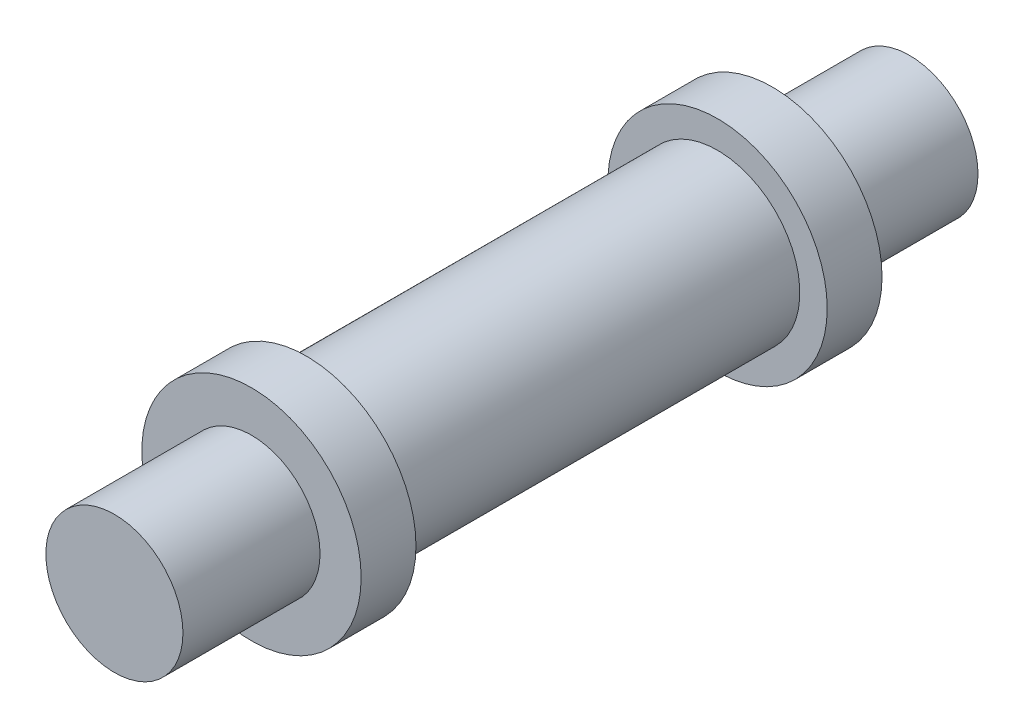
ISO-10303-21;
HEADER;
FILE_DESCRIPTION(('STEP AP214'),'2;1');
FILE_NAME('part.step','',(''),(''),'','','');
FILE_SCHEMA(('AUTOMOTIVE_DESIGN { 1 0 10303 214 1 1 1 1 }'));
ENDSEC;
DATA;
#1=APPLICATION_CONTEXT('core data for automotive mechanical design processes');
#2=APPLICATION_PROTOCOL_DEFINITION('international standard','automotive_design',2000,#1);
#3=PRODUCT_CONTEXT('',#1,'mechanical');
#4=PRODUCT('Part','Part','',(#3));
#5=PRODUCT_RELATED_PRODUCT_CATEGORY('part','',(#4));
#6=PRODUCT_DEFINITION_FORMATION('','',#4);
#7=PRODUCT_DEFINITION_CONTEXT('part definition',#1,'design');
#8=PRODUCT_DEFINITION('design','',#6,#7);
#9=PRODUCT_DEFINITION_SHAPE('','',#8);
#10=(LENGTH_UNIT() NAMED_UNIT(*) SI_UNIT(.MILLI.,.METRE.));
#11=(NAMED_UNIT(*) PLANE_ANGLE_UNIT() SI_UNIT($,.RADIAN.));
#12=(NAMED_UNIT(*) SI_UNIT($,.STERADIAN.) SOLID_ANGLE_UNIT());
#13=UNCERTAINTY_MEASURE_WITH_UNIT(LENGTH_MEASURE(1.E-05),#10,'distance_accuracy_value','');
#14=(GEOMETRIC_REPRESENTATION_CONTEXT(3) GLOBAL_UNCERTAINTY_ASSIGNED_CONTEXT((#13)) GLOBAL_UNIT_ASSIGNED_CONTEXT((#10,
#11,#12)) REPRESENTATION_CONTEXT('',''));
#15=CARTESIAN_POINT('',(0.,0.,0.));
#16=DIRECTION('',(0.,0.,1.));
#17=DIRECTION('',(1.,0.,0.));
#18=AXIS2_PLACEMENT_3D('',#15,#16,#17);
#19=CARTESIAN_POINT('',(0.,0.,6.35));
#20=DIRECTION('',(0.,0.,-1.));
#21=DIRECTION('',(-1.,0.,0.));
#22=AXIS2_PLACEMENT_3D('',#19,#20,#21);
#23=CYLINDRICAL_SURFACE('',#22,3.175);
#24=CARTESIAN_POINT('',(0.,0.,6.35));
#25=DIRECTION('',(0.,0.,1.));
#26=DIRECTION('',(1.,0.,0.));
#27=AXIS2_PLACEMENT_3D('',#24,#25,#26);
#28=CIRCLE('',#27,3.175);
#29=CARTESIAN_POINT('',(3.175,0.,6.35));
#30=VERTEX_POINT('',#29);
#31=EDGE_CURVE('E57',#30,#30,#28,.T.);
#32=ORIENTED_EDGE('',*,*,#31,.F.);
#33=EDGE_LOOP('',(#32));
#34=FACE_BOUND('',#33,.T.);
#35=CARTESIAN_POINT('',(0.,0.,0.));
#36=DIRECTION('',(0.,0.,1.));
#37=DIRECTION('',(1.,0.,0.));
#38=AXIS2_PLACEMENT_3D('',#35,#36,#37);
#39=CIRCLE('',#38,3.175);
#40=CARTESIAN_POINT('',(3.175,0.,0.));
#41=VERTEX_POINT('',#40);
#42=EDGE_CURVE('E46',#41,#41,#39,.T.);
#43=ORIENTED_EDGE('',*,*,#42,.T.);
#44=EDGE_LOOP('',(#43));
#45=FACE_BOUND('',#44,.T.);
#46=ADVANCED_FACE('F43',(#34,#45),#23,.T.);
#47=CARTESIAN_POINT('',(0.,0.,0.));
#48=DIRECTION('',(0.,0.,1.));
#49=DIRECTION('',(1.,0.,0.));
#50=AXIS2_PLACEMENT_3D('',#47,#48,#49);
#51=PLANE('',#50);
#52=ORIENTED_EDGE('',*,*,#42,.F.);
#53=EDGE_LOOP('',(#52));
#54=FACE_BOUND('',#53,.T.);
#55=ADVANCED_FACE('F90',(#54),#51,.F.);
#56=CARTESIAN_POINT('',(0.,0.,8.89));
#57=DIRECTION('',(0.,0.,-1.));
#58=DIRECTION('',(-1.,0.,0.));
#59=AXIS2_PLACEMENT_3D('',#56,#57,#58);
#60=CYLINDRICAL_SURFACE('',#59,5.08);
#61=CARTESIAN_POINT('',(0.,0.,8.89));
#62=DIRECTION('',(0.,0.,1.));
#63=DIRECTION('',(1.,0.,0.));
#64=AXIS2_PLACEMENT_3D('',#61,#62,#63);
#65=CIRCLE('',#64,5.08);
#66=CARTESIAN_POINT('',(5.08,0.,8.89));
#67=VERTEX_POINT('',#66);
#68=EDGE_CURVE('E75',#67,#67,#65,.T.);
#69=ORIENTED_EDGE('',*,*,#68,.F.);
#70=EDGE_LOOP('',(#69));
#71=FACE_BOUND('',#70,.T.);
#72=CARTESIAN_POINT('',(0.,0.,6.35));
#73=DIRECTION('',(0.,0.,1.));
#74=DIRECTION('',(1.,0.,0.));
#75=AXIS2_PLACEMENT_3D('',#72,#73,#74);
#76=CIRCLE('',#75,5.08);
#77=CARTESIAN_POINT('',(5.08,0.,6.35));
#78=VERTEX_POINT('',#77);
#79=EDGE_CURVE('E73',#78,#78,#76,.T.);
#80=ORIENTED_EDGE('',*,*,#79,.T.);
#81=EDGE_LOOP('',(#80));
#82=FACE_BOUND('',#81,.T.);
#83=ADVANCED_FACE('F92',(#71,#82),#60,.T.);
#84=CARTESIAN_POINT('',(0.,0.,8.89));
#85=DIRECTION('',(0.,0.,1.));
#86=DIRECTION('',(1.,0.,0.));
#87=AXIS2_PLACEMENT_3D('',#84,#85,#86);
#88=PLANE('',#87);
#89=CARTESIAN_POINT('',(0.,0.,8.89));
#90=DIRECTION('',(0.,0.,1.));
#91=DIRECTION('',(1.,0.,0.));
#92=AXIS2_PLACEMENT_3D('',#89,#90,#91);
#93=CIRCLE('',#92,3.81);
#94=CARTESIAN_POINT('',(-3.81,0.,8.89));
#95=VERTEX_POINT('',#94);
#96=EDGE_CURVE('E51',#95,#95,#93,.T.);
#97=ORIENTED_EDGE('',*,*,#96,.F.);
#98=EDGE_LOOP('',(#97));
#99=FACE_BOUND('',#98,.T.);
#100=ORIENTED_EDGE('',*,*,#68,.T.);
#101=EDGE_LOOP('',(#100));
#102=FACE_BOUND('',#101,.T.);
#103=ADVANCED_FACE('F97',(#99,#102),#88,.T.);
#104=CARTESIAN_POINT('',(0.,0.,6.35));
#105=DIRECTION('',(0.,0.,1.));
#106=DIRECTION('',(1.,0.,0.));
#107=AXIS2_PLACEMENT_3D('',#104,#105,#106);
#108=PLANE('',#107);
#109=ORIENTED_EDGE('',*,*,#31,.T.);
#110=EDGE_LOOP('',(#109));
#111=FACE_BOUND('',#110,.T.);
#112=ORIENTED_EDGE('',*,*,#79,.F.);
#113=EDGE_LOOP('',(#112));
#114=FACE_BOUND('',#113,.T.);
#115=ADVANCED_FACE('F102',(#111,#114),#108,.F.);
#116=CARTESIAN_POINT('',(0.,0.,27.94));
#117=DIRECTION('',(0.,0.,-1.));
#118=DIRECTION('',(-1.,0.,0.));
#119=AXIS2_PLACEMENT_3D('',#116,#117,#118);
#120=CYLINDRICAL_SURFACE('',#119,3.81);
#121=CARTESIAN_POINT('',(0.,0.,27.94));
#122=DIRECTION('',(0.,0.,1.));
#123=DIRECTION('',(1.,0.,0.));
#124=AXIS2_PLACEMENT_3D('',#121,#122,#123);
#125=CIRCLE('',#124,3.81);
#126=CARTESIAN_POINT('',(-3.81,0.,27.94));
#127=VERTEX_POINT('',#126);
#128=EDGE_CURVE('E66',#127,#127,#125,.T.);
#129=CARTESIAN_POINT('',(-3.81,0.,27.94));
#130=CARTESIAN_POINT('',(-3.81,0.,27.7415625));
#131=CARTESIAN_POINT('',(-3.81,0.,27.543125));
#132=CARTESIAN_POINT('',(-3.81,0.,27.14625));
#133=CARTESIAN_POINT('',(-3.81,0.,26.9478125));
#134=CARTESIAN_POINT('',(-3.81,0.,26.5509375));
#135=CARTESIAN_POINT('',(-3.81,0.,26.3525));
#136=CARTESIAN_POINT('',(-3.81,0.,25.955625));
#137=CARTESIAN_POINT('',(-3.81,0.,25.7571875));
#138=CARTESIAN_POINT('',(-3.81,0.,25.3603125));
#139=CARTESIAN_POINT('',(-3.81,0.,25.161875));
#140=CARTESIAN_POINT('',(-3.81,0.,24.765));
#141=CARTESIAN_POINT('',(-3.81,0.,24.5665625));
#142=CARTESIAN_POINT('',(-3.81,0.,24.1696875));
#143=CARTESIAN_POINT('',(-3.81,0.,23.97125));
#144=CARTESIAN_POINT('',(-3.81,0.,23.574375));
#145=CARTESIAN_POINT('',(-3.81,0.,23.3759375));
#146=CARTESIAN_POINT('',(-3.81,0.,22.9790625));
#147=CARTESIAN_POINT('',(-3.81,0.,22.780625));
#148=CARTESIAN_POINT('',(-3.81,0.,22.38375));
#149=CARTESIAN_POINT('',(-3.81,0.,22.1853125));
#150=CARTESIAN_POINT('',(-3.81,0.,21.7884375));
#151=CARTESIAN_POINT('',(-3.81,0.,21.59));
#152=CARTESIAN_POINT('',(-3.81,0.,21.193125));
#153=CARTESIAN_POINT('',(-3.81,0.,20.9946875));
#154=CARTESIAN_POINT('',(-3.81,0.,20.5978125));
#155=CARTESIAN_POINT('',(-3.81,0.,20.399375));
#156=CARTESIAN_POINT('',(-3.81,0.,20.0025));
#157=CARTESIAN_POINT('',(-3.81,0.,19.8040625));
#158=CARTESIAN_POINT('',(-3.81,0.,19.4071875));
#159=CARTESIAN_POINT('',(-3.81,0.,19.20875));
#160=CARTESIAN_POINT('',(-3.81,0.,18.811875));
#161=CARTESIAN_POINT('',(-3.81,0.,18.6134375));
#162=CARTESIAN_POINT('',(-3.81,0.,18.2165625));
#163=CARTESIAN_POINT('',(-3.81,0.,18.018125));
#164=CARTESIAN_POINT('',(-3.81,0.,17.62125));
#165=CARTESIAN_POINT('',(-3.81,0.,17.4228125));
#166=CARTESIAN_POINT('',(-3.81,0.,17.0259375));
#167=CARTESIAN_POINT('',(-3.81,0.,16.8275));
#168=CARTESIAN_POINT('',(-3.81,0.,16.430625));
#169=CARTESIAN_POINT('',(-3.81,0.,16.2321875));
#170=CARTESIAN_POINT('',(-3.81,0.,15.8353125));
#171=CARTESIAN_POINT('',(-3.81,0.,15.636875));
#172=CARTESIAN_POINT('',(-3.81,0.,15.24));
#173=CARTESIAN_POINT('',(-3.81,0.,15.0415625));
#174=CARTESIAN_POINT('',(-3.81,0.,14.6446875));
#175=CARTESIAN_POINT('',(-3.81,0.,14.44625));
#176=CARTESIAN_POINT('',(-3.81,0.,14.049375));
#177=CARTESIAN_POINT('',(-3.81,0.,13.8509375));
#178=CARTESIAN_POINT('',(-3.81,0.,13.4540625));
#179=CARTESIAN_POINT('',(-3.81,0.,13.255625));
#180=CARTESIAN_POINT('',(-3.81,0.,12.85875));
#181=CARTESIAN_POINT('',(-3.81,0.,12.6603125));
#182=CARTESIAN_POINT('',(-3.81,0.,12.2634375));
#183=CARTESIAN_POINT('',(-3.81,0.,12.065));
#184=CARTESIAN_POINT('',(-3.81,0.,11.668125));
#185=CARTESIAN_POINT('',(-3.81,0.,11.4696875));
#186=CARTESIAN_POINT('',(-3.81,0.,11.0728125));
#187=CARTESIAN_POINT('',(-3.81,0.,10.874375));
#188=CARTESIAN_POINT('',(-3.81,0.,10.4775));
#189=CARTESIAN_POINT('',(-3.81,0.,10.2790625));
#190=CARTESIAN_POINT('',(-3.81,0.,9.8821875));
#191=CARTESIAN_POINT('',(-3.81,0.,9.68375));
#192=CARTESIAN_POINT('',(-3.81,0.,9.286875));
#193=CARTESIAN_POINT('',(-3.81,0.,9.0884375));
#194=CARTESIAN_POINT('',(-3.81,0.,8.89));
#195=B_SPLINE_CURVE_WITH_KNOTS('',3,(#129,#130,#131,#132,#133,#134,#135,#136,#137,#138,#139,
#140,#141,#142,#143,#144,#145,#146,#147,#148,#149,#150,#151,#152,#153,#154,#155,#156,#157,#158,
#159,#160,#161,#162,#163,#164,#165,#166,#167,#168,#169,#170,#171,#172,#173,#174,#175,#176,#177,
#178,#179,#180,#181,#182,#183,#184,#185,#186,#187,#188,#189,#190,#191,#192,#193,#194),
.UNSPECIFIED.,.F.,.F.,(4,2,2,2,2,2,2,2,2,2,2,2,2,2,2,2,2,2,2,2,2,2,2,2,2,2,2,2,2,2,2,2,4),(0.,
0.5953125,1.190625,1.7859375,2.38125,2.9765625,3.571875,4.1671875,4.7625,5.3578125,5.953125,
6.5484375,7.14375,7.7390625,8.334375,8.9296875,9.525,10.1203125,10.715625,11.3109375,11.90625,
12.5015625,13.096875,13.6921875,14.2875,14.8828125,15.478125,16.0734375,16.66875,17.2640625,
17.859375,18.4546875,19.05),.UNSPECIFIED.);
#196=EDGE_CURVE('BSEAM105',#127,#95,#195,.T.);
#197=ORIENTED_EDGE('',*,*,#128,.F.);
#198=ORIENTED_EDGE('',*,*,#96,.T.);
#199=ORIENTED_EDGE('',*,*,#196,.T.);
#200=ORIENTED_EDGE('',*,*,#196,.F.);
#201=EDGE_LOOP('',(#197,#199,#198,#200));
#202=FACE_BOUND('',#201,.T.);
#203=ADVANCED_FACE('F105',(#202),#120,.T.);
#204=CARTESIAN_POINT('',(0.,0.,30.48));
#205=DIRECTION('',(0.,0.,-1.));
#206=DIRECTION('',(-1.,0.,0.));
#207=AXIS2_PLACEMENT_3D('',#204,#205,#206);
#208=CYLINDRICAL_SURFACE('',#207,5.08);
#209=CARTESIAN_POINT('',(0.,0.,30.48));
#210=DIRECTION('',(0.,0.,1.));
#211=DIRECTION('',(1.,0.,0.));
#212=AXIS2_PLACEMENT_3D('',#209,#210,#211);
#213=CIRCLE('',#212,5.08);
#214=CARTESIAN_POINT('',(5.08,0.,30.48));
#215=VERTEX_POINT('',#214);
#216=EDGE_CURVE('E62',#215,#215,#213,.T.);
#217=ORIENTED_EDGE('',*,*,#216,.F.);
#218=EDGE_LOOP('',(#217));
#219=FACE_BOUND('',#218,.T.);
#220=CARTESIAN_POINT('',(0.,0.,27.94));
#221=DIRECTION('',(0.,0.,1.));
#222=DIRECTION('',(1.,0.,0.));
#223=AXIS2_PLACEMENT_3D('',#220,#221,#222);
#224=CIRCLE('',#223,5.08);
#225=CARTESIAN_POINT('',(5.08,0.,27.94));
#226=VERTEX_POINT('',#225);
#227=EDGE_CURVE('E67',#226,#226,#224,.T.);
#228=ORIENTED_EDGE('',*,*,#227,.T.);
#229=EDGE_LOOP('',(#228));
#230=FACE_BOUND('',#229,.T.);
#231=ADVANCED_FACE('F111',(#219,#230),#208,.T.);
#232=CARTESIAN_POINT('',(0.,0.,30.48));
#233=DIRECTION('',(0.,0.,1.));
#234=DIRECTION('',(1.,0.,0.));
#235=AXIS2_PLACEMENT_3D('',#232,#233,#234);
#236=PLANE('',#235);
#237=CARTESIAN_POINT('',(0.,0.,30.48));
#238=DIRECTION('',(0.,0.,1.));
#239=DIRECTION('',(1.,0.,0.));
#240=AXIS2_PLACEMENT_3D('',#237,#238,#239);
#241=CIRCLE('',#240,3.175);
#242=CARTESIAN_POINT('',(3.175,0.,30.48));
#243=VERTEX_POINT('',#242);
#244=EDGE_CURVE('E10',#243,#243,#241,.T.);
#245=ORIENTED_EDGE('',*,*,#244,.F.);
#246=EDGE_LOOP('',(#245));
#247=FACE_BOUND('',#246,.T.);
#248=ORIENTED_EDGE('',*,*,#216,.T.);
#249=EDGE_LOOP('',(#248));
#250=FACE_BOUND('',#249,.T.);
#251=ADVANCED_FACE('F115',(#247,#250),#236,.T.);
#252=CARTESIAN_POINT('',(0.,0.,27.94));
#253=DIRECTION('',(0.,0.,1.));
#254=DIRECTION('',(1.,0.,0.));
#255=AXIS2_PLACEMENT_3D('',#252,#253,#254);
#256=PLANE('',#255);
#257=ORIENTED_EDGE('',*,*,#128,.T.);
#258=EDGE_LOOP('',(#257));
#259=FACE_BOUND('',#258,.T.);
#260=ORIENTED_EDGE('',*,*,#227,.F.);
#261=EDGE_LOOP('',(#260));
#262=FACE_BOUND('',#261,.T.);
#263=ADVANCED_FACE('F117',(#259,#262),#256,.F.);
#264=CARTESIAN_POINT('',(0.,0.,36.83));
#265=DIRECTION('',(0.,0.,-1.));
#266=DIRECTION('',(-1.,0.,0.));
#267=AXIS2_PLACEMENT_3D('',#264,#265,#266);
#268=CYLINDRICAL_SURFACE('',#267,3.175);
#269=CARTESIAN_POINT('',(0.,0.,36.83));
#270=DIRECTION('',(0.,0.,1.));
#271=DIRECTION('',(1.,0.,0.));
#272=AXIS2_PLACEMENT_3D('',#269,#270,#271);
#273=CIRCLE('',#272,3.175);
#274=CARTESIAN_POINT('',(3.175,0.,36.83));
#275=VERTEX_POINT('',#274);
#276=EDGE_CURVE('E61',#275,#275,#273,.T.);
#277=ORIENTED_EDGE('',*,*,#276,.F.);
#278=EDGE_LOOP('',(#277));
#279=FACE_BOUND('',#278,.T.);
#280=ORIENTED_EDGE('',*,*,#244,.T.);
#281=EDGE_LOOP('',(#280));
#282=FACE_BOUND('',#281,.T.);
#283=ADVANCED_FACE('F120',(#279,#282),#268,.T.);
#284=CARTESIAN_POINT('',(0.,0.,36.83));
#285=DIRECTION('',(0.,0.,1.));
#286=DIRECTION('',(1.,0.,0.));
#287=AXIS2_PLACEMENT_3D('',#284,#285,#286);
#288=PLANE('',#287);
#289=ORIENTED_EDGE('',*,*,#276,.T.);
#290=EDGE_LOOP('',(#289));
#291=FACE_BOUND('',#290,.T.);
#292=ADVANCED_FACE('F127',(#291),#288,.T.);
#293=CLOSED_SHELL('',(#46,#55,#83,#103,#115,#203,#231,#251,#263,#283,#292));
#294=MANIFOLD_SOLID_BREP('B2',#293);
#295=ADVANCED_BREP_SHAPE_REPRESENTATION('',(#18,#294),#14);
#296=SHAPE_DEFINITION_REPRESENTATION(#9,#295);
ENDSEC;
END-ISO-10303-21;
